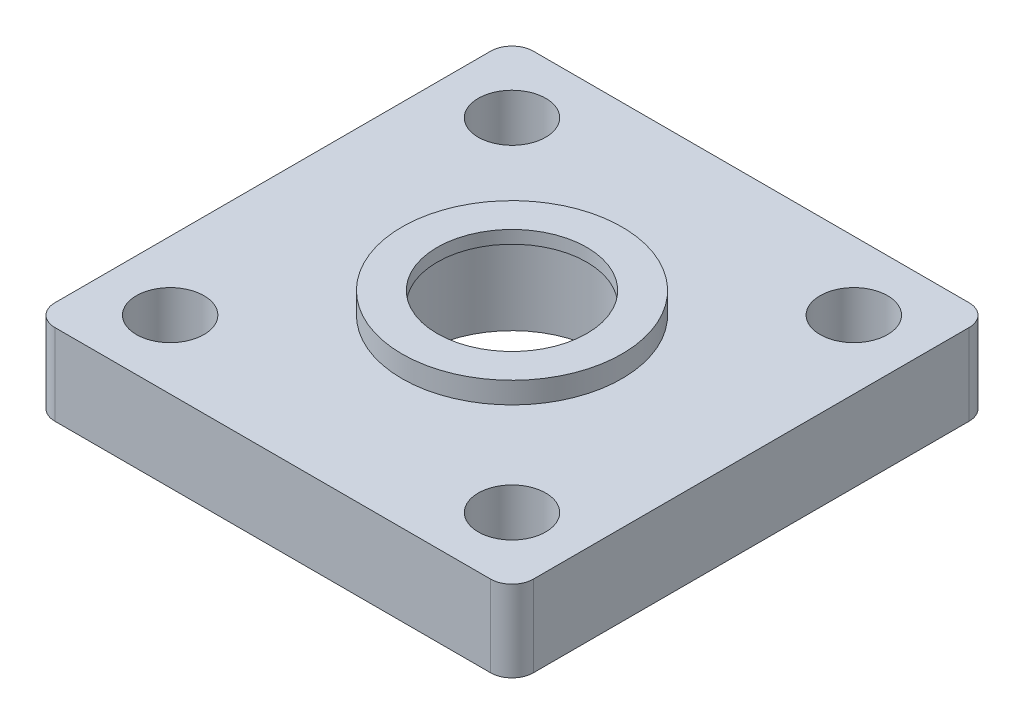
ISO-10303-21;
HEADER;
FILE_DESCRIPTION(('STEP AP214'),'2;1');
FILE_NAME('part.step','',(''),(''),'','','');
FILE_SCHEMA(('AUTOMOTIVE_DESIGN { 1 0 10303 214 1 1 1 1 }'));
ENDSEC;
DATA;
#1=APPLICATION_CONTEXT('core data for automotive mechanical design processes');
#2=APPLICATION_PROTOCOL_DEFINITION('international standard','automotive_design',2000,#1);
#3=PRODUCT_CONTEXT('',#1,'mechanical');
#4=PRODUCT('Part','Part','',(#3));
#5=PRODUCT_RELATED_PRODUCT_CATEGORY('part','',(#4));
#6=PRODUCT_DEFINITION_FORMATION('','',#4);
#7=PRODUCT_DEFINITION_CONTEXT('part definition',#1,'design');
#8=PRODUCT_DEFINITION('design','',#6,#7);
#9=PRODUCT_DEFINITION_SHAPE('','',#8);
#10=(LENGTH_UNIT() NAMED_UNIT(*) SI_UNIT(.MILLI.,.METRE.));
#11=(NAMED_UNIT(*) PLANE_ANGLE_UNIT() SI_UNIT($,.RADIAN.));
#12=(NAMED_UNIT(*) SI_UNIT($,.STERADIAN.) SOLID_ANGLE_UNIT());
#13=UNCERTAINTY_MEASURE_WITH_UNIT(LENGTH_MEASURE(1.E-05),#10,'distance_accuracy_value','');
#14=(GEOMETRIC_REPRESENTATION_CONTEXT(3) GLOBAL_UNCERTAINTY_ASSIGNED_CONTEXT((#13)) GLOBAL_UNIT_ASSIGNED_CONTEXT((#10,
#11,#12)) REPRESENTATION_CONTEXT('',''));
#15=CARTESIAN_POINT('',(0.,0.,0.));
#16=DIRECTION('',(0.,0.,1.));
#17=DIRECTION('',(1.,0.,0.));
#18=AXIS2_PLACEMENT_3D('',#15,#16,#17);
#19=CARTESIAN_POINT('',(0.,0.,0.));
#20=DIRECTION('',(0.,1.,0.));
#21=DIRECTION('',(0.,0.,1.));
#22=AXIS2_PLACEMENT_3D('',#19,#20,#21);
#23=PLANE('',#22);
#24=DIRECTION('',(-1.,0.,0.));
#25=VECTOR('',#24,1.);
#26=CARTESIAN_POINT('',(-56.,0.,-56.));
#27=LINE('',#26,#25);
#28=CARTESIAN_POINT('',(51.,0.,-56.));
#29=VERTEX_POINT('',#28);
#30=CARTESIAN_POINT('',(-51.,0.,-56.));
#31=VERTEX_POINT('',#30);
#32=EDGE_CURVE('E226',#29,#31,#27,.T.);
#33=ORIENTED_EDGE('',*,*,#32,.F.);
#34=CARTESIAN_POINT('',(51.,0.,-51.));
#35=DIRECTION('',(0.,1.,0.));
#36=DIRECTION('',(0.,0.,1.));
#37=AXIS2_PLACEMENT_3D('',#34,#35,#36);
#38=CIRCLE('',#37,5.);
#39=CARTESIAN_POINT('',(56.,0.,-51.));
#40=VERTEX_POINT('',#39);
#41=EDGE_CURVE('E291',#29,#40,#38,.F.);
#42=ORIENTED_EDGE('',*,*,#41,.T.);
#43=DIRECTION('',(0.,0.,-1.));
#44=VECTOR('',#43,1.);
#45=CARTESIAN_POINT('',(56.,0.,-56.));
#46=LINE('',#45,#44);
#47=CARTESIAN_POINT('',(56.,0.,51.));
#48=VERTEX_POINT('',#47);
#49=EDGE_CURVE('E202',#48,#40,#46,.T.);
#50=ORIENTED_EDGE('',*,*,#49,.F.);
#51=CARTESIAN_POINT('',(51.,0.,51.));
#52=DIRECTION('',(0.,1.,0.));
#53=DIRECTION('',(0.,0.,1.));
#54=AXIS2_PLACEMENT_3D('',#51,#52,#53);
#55=CIRCLE('',#54,5.);
#56=CARTESIAN_POINT('',(51.,0.,56.));
#57=VERTEX_POINT('',#56);
#58=EDGE_CURVE('E288',#48,#57,#55,.F.);
#59=ORIENTED_EDGE('',*,*,#58,.T.);
#60=DIRECTION('',(1.,0.,0.));
#61=VECTOR('',#60,1.);
#62=CARTESIAN_POINT('',(-56.,0.,56.));
#63=LINE('',#62,#61);
#64=CARTESIAN_POINT('',(-51.,0.,56.));
#65=VERTEX_POINT('',#64);
#66=EDGE_CURVE('E214',#65,#57,#63,.T.);
#67=ORIENTED_EDGE('',*,*,#66,.F.);
#68=CARTESIAN_POINT('',(-51.,0.,51.));
#69=DIRECTION('',(0.,1.,0.));
#70=DIRECTION('',(0.,0.,1.));
#71=AXIS2_PLACEMENT_3D('',#68,#69,#70);
#72=CIRCLE('',#71,5.);
#73=CARTESIAN_POINT('',(-56.,0.,51.));
#74=VERTEX_POINT('',#73);
#75=EDGE_CURVE('E285',#65,#74,#72,.F.);
#76=ORIENTED_EDGE('',*,*,#75,.T.);
#77=DIRECTION('',(0.,0.,1.));
#78=VECTOR('',#77,1.);
#79=CARTESIAN_POINT('',(-56.,0.,-56.));
#80=LINE('',#79,#78);
#81=CARTESIAN_POINT('',(-56.,0.,-51.));
#82=VERTEX_POINT('',#81);
#83=EDGE_CURVE('E230',#82,#74,#80,.T.);
#84=ORIENTED_EDGE('',*,*,#83,.F.);
#85=CARTESIAN_POINT('',(-51.,0.,-51.));
#86=DIRECTION('',(0.,1.,0.));
#87=DIRECTION('',(0.,0.,1.));
#88=AXIS2_PLACEMENT_3D('',#85,#86,#87);
#89=CIRCLE('',#88,5.);
#90=EDGE_CURVE('E282',#82,#31,#89,.F.);
#91=ORIENTED_EDGE('',*,*,#90,.T.);
#92=EDGE_LOOP('',(#33,#42,#50,#59,#67,#76,#84,#91));
#93=FACE_BOUND('',#92,.T.);
#94=DIRECTION('',(0.,0.,1.));
#95=VECTOR('',#94,1.);
#96=CARTESIAN_POINT('',(50.,0.,50.));
#97=LINE('',#96,#95);
#98=CARTESIAN_POINT('',(50.,0.,-45.));
#99=VERTEX_POINT('',#98);
#100=CARTESIAN_POINT('',(50.,0.,45.));
#101=VERTEX_POINT('',#100);
#102=EDGE_CURVE('E183',#99,#101,#97,.T.);
#103=ORIENTED_EDGE('',*,*,#102,.F.);
#104=CARTESIAN_POINT('',(45.,0.,-45.));
#105=DIRECTION('',(0.,1.,0.));
#106=DIRECTION('',(0.,0.,1.));
#107=AXIS2_PLACEMENT_3D('',#104,#105,#106);
#108=CIRCLE('',#107,5.);
#109=CARTESIAN_POINT('',(45.,0.,-50.));
#110=VERTEX_POINT('',#109);
#111=EDGE_CURVE('E329',#99,#110,#108,.T.);
#112=ORIENTED_EDGE('',*,*,#111,.T.);
#113=DIRECTION('',(1.,0.,0.));
#114=VECTOR('',#113,1.);
#115=CARTESIAN_POINT('',(-50.,0.,-50.));
#116=LINE('',#115,#114);
#117=CARTESIAN_POINT('',(-45.,0.,-50.));
#118=VERTEX_POINT('',#117);
#119=EDGE_CURVE('E188',#118,#110,#116,.T.);
#120=ORIENTED_EDGE('',*,*,#119,.F.);
#121=CARTESIAN_POINT('',(-45.,0.,-45.));
#122=DIRECTION('',(0.,1.,0.));
#123=DIRECTION('',(0.,0.,1.));
#124=AXIS2_PLACEMENT_3D('',#121,#122,#123);
#125=CIRCLE('',#124,5.);
#126=CARTESIAN_POINT('',(-50.,0.,-45.));
#127=VERTEX_POINT('',#126);
#128=EDGE_CURVE('E326',#118,#127,#125,.T.);
#129=ORIENTED_EDGE('',*,*,#128,.T.);
#130=DIRECTION('',(0.,0.,-1.));
#131=VECTOR('',#130,1.);
#132=CARTESIAN_POINT('',(-50.,0.,50.));
#133=LINE('',#132,#131);
#134=CARTESIAN_POINT('',(-50.,0.,45.));
#135=VERTEX_POINT('',#134);
#136=EDGE_CURVE('E182',#135,#127,#133,.T.);
#137=ORIENTED_EDGE('',*,*,#136,.F.);
#138=CARTESIAN_POINT('',(-45.,0.,45.));
#139=DIRECTION('',(0.,1.,0.));
#140=DIRECTION('',(0.,0.,1.));
#141=AXIS2_PLACEMENT_3D('',#138,#139,#140);
#142=CIRCLE('',#141,5.);
#143=CARTESIAN_POINT('',(-45.,0.,50.));
#144=VERTEX_POINT('',#143);
#145=EDGE_CURVE('E165',#135,#144,#142,.T.);
#146=ORIENTED_EDGE('',*,*,#145,.T.);
#147=DIRECTION('',(-1.,0.,0.));
#148=VECTOR('',#147,1.);
#149=CARTESIAN_POINT('',(-50.,0.,50.));
#150=LINE('',#149,#148);
#151=CARTESIAN_POINT('',(45.,0.,50.));
#152=VERTEX_POINT('',#151);
#153=EDGE_CURVE('E172',#152,#144,#150,.T.);
#154=ORIENTED_EDGE('',*,*,#153,.F.);
#155=CARTESIAN_POINT('',(45.,0.,45.));
#156=DIRECTION('',(0.,1.,0.));
#157=DIRECTION('',(0.,0.,1.));
#158=AXIS2_PLACEMENT_3D('',#155,#156,#157);
#159=CIRCLE('',#158,5.);
#160=EDGE_CURVE('E154',#152,#101,#159,.T.);
#161=ORIENTED_EDGE('',*,*,#160,.T.);
#162=EDGE_LOOP('',(#103,#112,#120,#129,#137,#146,#154,#161));
#163=FACE_BOUND('',#162,.T.);
#164=ADVANCED_FACE('F38',(#93,#163),#23,.F.);
#165=CARTESIAN_POINT('',(56.,19.,-56.));
#166=DIRECTION('',(-1.,0.,0.));
#167=DIRECTION('',(0.,0.,1.));
#168=AXIS2_PLACEMENT_3D('',#165,#166,#167);
#169=PLANE('',#168);
#170=ORIENTED_EDGE('',*,*,#49,.T.);
#171=DIRECTION('',(0.,-1.,0.));
#172=VECTOR('',#171,1.);
#173=CARTESIAN_POINT('',(56.,19.,-51.));
#174=LINE('',#173,#172);
#175=CARTESIAN_POINT('',(56.,19.,-51.));
#176=VERTEX_POINT('',#175);
#177=EDGE_CURVE('E298',#40,#176,#174,.F.);
#178=ORIENTED_EDGE('',*,*,#177,.T.);
#179=DIRECTION('',(0.,0.,-1.));
#180=VECTOR('',#179,1.);
#181=CARTESIAN_POINT('',(56.,19.,-56.));
#182=LINE('',#181,#180);
#183=CARTESIAN_POINT('',(56.,19.,51.));
#184=VERTEX_POINT('',#183);
#185=EDGE_CURVE('E209',#184,#176,#182,.T.);
#186=ORIENTED_EDGE('',*,*,#185,.F.);
#187=DIRECTION('',(0.,-1.,0.));
#188=VECTOR('',#187,1.);
#189=CARTESIAN_POINT('',(56.,19.,51.));
#190=LINE('',#189,#188);
#191=EDGE_CURVE('E294',#184,#48,#190,.T.);
#192=ORIENTED_EDGE('',*,*,#191,.T.);
#193=EDGE_LOOP('',(#170,#178,#186,#192));
#194=FACE_BOUND('',#193,.T.);
#195=ADVANCED_FACE('F348',(#194),#169,.F.);
#196=CARTESIAN_POINT('',(-56.,19.,-56.));
#197=DIRECTION('',(0.,0.,1.));
#198=DIRECTION('',(1.,0.,0.));
#199=AXIS2_PLACEMENT_3D('',#196,#197,#198);
#200=PLANE('',#199);
#201=DIRECTION('',(-1.,0.,0.));
#202=VECTOR('',#201,1.);
#203=CARTESIAN_POINT('',(-56.,19.,-56.));
#204=LINE('',#203,#202);
#205=CARTESIAN_POINT('',(51.,19.,-56.));
#206=VERTEX_POINT('',#205);
#207=CARTESIAN_POINT('',(-51.,19.,-56.));
#208=VERTEX_POINT('',#207);
#209=EDGE_CURVE('E213',#206,#208,#204,.T.);
#210=ORIENTED_EDGE('',*,*,#209,.F.);
#211=DIRECTION('',(0.,-1.,0.));
#212=VECTOR('',#211,1.);
#213=CARTESIAN_POINT('',(51.,19.,-56.));
#214=LINE('',#213,#212);
#215=EDGE_CURVE('E278',#206,#29,#214,.T.);
#216=ORIENTED_EDGE('',*,*,#215,.T.);
#217=ORIENTED_EDGE('',*,*,#32,.T.);
#218=DIRECTION('',(0.,-1.,0.));
#219=VECTOR('',#218,1.);
#220=CARTESIAN_POINT('',(-51.,19.,-56.));
#221=LINE('',#220,#219);
#222=EDGE_CURVE('E275',#31,#208,#221,.F.);
#223=ORIENTED_EDGE('',*,*,#222,.T.);
#224=EDGE_LOOP('',(#210,#216,#217,#223));
#225=FACE_BOUND('',#224,.T.);
#226=ADVANCED_FACE('F354',(#225),#200,.F.);
#227=CARTESIAN_POINT('',(-56.,19.,-56.));
#228=DIRECTION('',(1.,0.,0.));
#229=DIRECTION('',(0.,0.,-1.));
#230=AXIS2_PLACEMENT_3D('',#227,#228,#229);
#231=PLANE('',#230);
#232=ORIENTED_EDGE('',*,*,#83,.T.);
#233=DIRECTION('',(0.,-1.,0.));
#234=VECTOR('',#233,1.);
#235=CARTESIAN_POINT('',(-56.,19.,51.));
#236=LINE('',#235,#234);
#237=CARTESIAN_POINT('',(-56.,19.,51.));
#238=VERTEX_POINT('',#237);
#239=EDGE_CURVE('E166',#74,#238,#236,.F.);
#240=ORIENTED_EDGE('',*,*,#239,.T.);
#241=DIRECTION('',(0.,0.,1.));
#242=VECTOR('',#241,1.);
#243=CARTESIAN_POINT('',(-56.,19.,-56.));
#244=LINE('',#243,#242);
#245=CARTESIAN_POINT('',(-56.,19.,-51.));
#246=VERTEX_POINT('',#245);
#247=EDGE_CURVE('E218',#246,#238,#244,.T.);
#248=ORIENTED_EDGE('',*,*,#247,.F.);
#249=DIRECTION('',(0.,-1.,0.));
#250=VECTOR('',#249,1.);
#251=CARTESIAN_POINT('',(-56.,19.,-51.));
#252=LINE('',#251,#250);
#253=EDGE_CURVE('E318',#246,#82,#252,.T.);
#254=ORIENTED_EDGE('',*,*,#253,.T.);
#255=EDGE_LOOP('',(#232,#240,#248,#254));
#256=FACE_BOUND('',#255,.T.);
#257=ADVANCED_FACE('F365',(#256),#231,.F.);
#258=CARTESIAN_POINT('',(-56.,19.,56.));
#259=DIRECTION('',(0.,0.,-1.));
#260=DIRECTION('',(-1.,0.,0.));
#261=AXIS2_PLACEMENT_3D('',#258,#259,#260);
#262=PLANE('',#261);
#263=ORIENTED_EDGE('',*,*,#66,.T.);
#264=DIRECTION('',(0.,-1.,0.));
#265=VECTOR('',#264,1.);
#266=CARTESIAN_POINT('',(51.,19.,56.));
#267=LINE('',#266,#265);
#268=CARTESIAN_POINT('',(51.,19.,56.));
#269=VERTEX_POINT('',#268);
#270=EDGE_CURVE('E54',#57,#269,#267,.F.);
#271=ORIENTED_EDGE('',*,*,#270,.T.);
#272=DIRECTION('',(1.,0.,0.));
#273=VECTOR('',#272,1.);
#274=CARTESIAN_POINT('',(-56.,19.,56.));
#275=LINE('',#274,#273);
#276=CARTESIAN_POINT('',(-51.,19.,56.));
#277=VERTEX_POINT('',#276);
#278=EDGE_CURVE('E208',#277,#269,#275,.T.);
#279=ORIENTED_EDGE('',*,*,#278,.F.);
#280=DIRECTION('',(0.,-1.,0.));
#281=VECTOR('',#280,1.);
#282=CARTESIAN_POINT('',(-51.,19.,56.));
#283=LINE('',#282,#281);
#284=EDGE_CURVE('E312',#277,#65,#283,.T.);
#285=ORIENTED_EDGE('',*,*,#284,.T.);
#286=EDGE_LOOP('',(#263,#271,#279,#285));
#287=FACE_BOUND('',#286,.T.);
#288=ADVANCED_FACE('F362',(#287),#262,.F.);
#289=CARTESIAN_POINT('',(0.,19.,0.));
#290=DIRECTION('',(0.,1.,0.));
#291=DIRECTION('',(0.,0.,1.));
#292=AXIS2_PLACEMENT_3D('',#289,#290,#291);
#293=PLANE('',#292);
#294=CARTESIAN_POINT('',(-40.,19.,40.));
#295=DIRECTION('',(0.,1.,0.));
#296=DIRECTION('',(0.,0.,1.));
#297=AXIS2_PLACEMENT_3D('',#294,#295,#296);
#298=CIRCLE('',#297,7.9);
#299=CARTESIAN_POINT('',(-40.,19.,47.9));
#300=VERTEX_POINT('',#299);
#301=EDGE_CURVE('E426',#300,#300,#298,.T.);
#302=ORIENTED_EDGE('',*,*,#301,.F.);
#303=EDGE_LOOP('',(#302));
#304=FACE_BOUND('',#303,.T.);
#305=CARTESIAN_POINT('',(40.,19.,40.));
#306=DIRECTION('',(0.,1.,0.));
#307=DIRECTION('',(0.,0.,1.));
#308=AXIS2_PLACEMENT_3D('',#305,#306,#307);
#309=CIRCLE('',#308,7.9);
#310=CARTESIAN_POINT('',(40.,19.,47.9));
#311=VERTEX_POINT('',#310);
#312=EDGE_CURVE('E430',#311,#311,#309,.T.);
#313=ORIENTED_EDGE('',*,*,#312,.F.);
#314=EDGE_LOOP('',(#313));
#315=FACE_BOUND('',#314,.T.);
#316=CARTESIAN_POINT('',(40.,19.,-40.));
#317=DIRECTION('',(0.,1.,0.));
#318=DIRECTION('',(0.,0.,1.));
#319=AXIS2_PLACEMENT_3D('',#316,#317,#318);
#320=CIRCLE('',#319,7.9);
#321=CARTESIAN_POINT('',(40.,19.,-32.1));
#322=VERTEX_POINT('',#321);
#323=EDGE_CURVE('E434',#322,#322,#320,.T.);
#324=ORIENTED_EDGE('',*,*,#323,.F.);
#325=EDGE_LOOP('',(#324));
#326=FACE_BOUND('',#325,.T.);
#327=CARTESIAN_POINT('',(-40.,19.,-40.));
#328=DIRECTION('',(0.,1.,0.));
#329=DIRECTION('',(0.,0.,1.));
#330=AXIS2_PLACEMENT_3D('',#327,#328,#329);
#331=CIRCLE('',#330,7.9);
#332=CARTESIAN_POINT('',(-40.,19.,-32.1));
#333=VERTEX_POINT('',#332);
#334=EDGE_CURVE('E438',#333,#333,#331,.T.);
#335=ORIENTED_EDGE('',*,*,#334,.F.);
#336=EDGE_LOOP('',(#335));
#337=FACE_BOUND('',#336,.T.);
#338=CARTESIAN_POINT('',(0.,19.,0.));
#339=DIRECTION('',(0.,1.,0.));
#340=DIRECTION('',(0.,0.,1.));
#341=AXIS2_PLACEMENT_3D('',#338,#339,#340);
#342=CIRCLE('',#341,25.75);
#343=CARTESIAN_POINT('',(0.,19.,25.75));
#344=VERTEX_POINT('',#343);
#345=EDGE_CURVE('E204',#344,#344,#342,.T.);
#346=ORIENTED_EDGE('',*,*,#345,.F.);
#347=EDGE_LOOP('',(#346));
#348=FACE_BOUND('',#347,.T.);
#349=ORIENTED_EDGE('',*,*,#185,.T.);
#350=CARTESIAN_POINT('',(51.,19.,-51.));
#351=DIRECTION('',(0.,1.,0.));
#352=DIRECTION('',(0.,0.,1.));
#353=AXIS2_PLACEMENT_3D('',#350,#351,#352);
#354=CIRCLE('',#353,5.);
#355=EDGE_CURVE('E309',#176,#206,#354,.T.);
#356=ORIENTED_EDGE('',*,*,#355,.T.);
#357=ORIENTED_EDGE('',*,*,#209,.T.);
#358=CARTESIAN_POINT('',(-51.,19.,-51.));
#359=DIRECTION('',(0.,1.,0.));
#360=DIRECTION('',(0.,0.,1.));
#361=AXIS2_PLACEMENT_3D('',#358,#359,#360);
#362=CIRCLE('',#361,5.);
#363=EDGE_CURVE('E301',#208,#246,#362,.T.);
#364=ORIENTED_EDGE('',*,*,#363,.T.);
#365=ORIENTED_EDGE('',*,*,#247,.T.);
#366=CARTESIAN_POINT('',(-51.,19.,51.));
#367=DIRECTION('',(0.,1.,0.));
#368=DIRECTION('',(0.,0.,1.));
#369=AXIS2_PLACEMENT_3D('',#366,#367,#368);
#370=CIRCLE('',#369,5.);
#371=EDGE_CURVE('E61',#238,#277,#370,.T.);
#372=ORIENTED_EDGE('',*,*,#371,.T.);
#373=ORIENTED_EDGE('',*,*,#278,.T.);
#374=CARTESIAN_POINT('',(51.,19.,51.));
#375=DIRECTION('',(0.,1.,0.));
#376=DIRECTION('',(0.,0.,1.));
#377=AXIS2_PLACEMENT_3D('',#374,#375,#376);
#378=CIRCLE('',#377,5.);
#379=EDGE_CURVE('E306',#269,#184,#378,.T.);
#380=ORIENTED_EDGE('',*,*,#379,.T.);
#381=EDGE_LOOP('',(#349,#356,#357,#364,#365,#372,#373,#380));
#382=FACE_BOUND('',#381,.T.);
#383=ADVANCED_FACE('F360',(#304,#315,#326,#337,#348,#382),#293,.T.);
#384=CARTESIAN_POINT('',(0.,24.,0.));
#385=DIRECTION('',(0.,-1.,0.));
#386=DIRECTION('',(0.,0.,-1.));
#387=AXIS2_PLACEMENT_3D('',#384,#385,#386);
#388=CYLINDRICAL_SURFACE('',#387,25.75);
#389=CARTESIAN_POINT('',(0.,24.,0.));
#390=DIRECTION('',(0.,1.,0.));
#391=DIRECTION('',(0.,0.,1.));
#392=AXIS2_PLACEMENT_3D('',#389,#390,#391);
#393=CIRCLE('',#392,25.75);
#394=CARTESIAN_POINT('',(0.,24.,25.75));
#395=VERTEX_POINT('',#394);
#396=EDGE_CURVE('E198',#395,#395,#393,.T.);
#397=ORIENTED_EDGE('',*,*,#396,.F.);
#398=EDGE_LOOP('',(#397));
#399=FACE_BOUND('',#398,.T.);
#400=ORIENTED_EDGE('',*,*,#345,.T.);
#401=EDGE_LOOP('',(#400));
#402=FACE_BOUND('',#401,.T.);
#403=ADVANCED_FACE('F416',(#399,#402),#388,.T.);
#404=CARTESIAN_POINT('',(0.,24.,0.));
#405=DIRECTION('',(0.,1.,0.));
#406=DIRECTION('',(0.,0.,1.));
#407=AXIS2_PLACEMENT_3D('',#404,#405,#406);
#408=PLANE('',#407);
#409=CARTESIAN_POINT('',(0.,24.,0.));
#410=DIRECTION('',(0.,1.,0.));
#411=DIRECTION('',(0.,0.,1.));
#412=AXIS2_PLACEMENT_3D('',#409,#410,#411);
#413=CIRCLE('',#412,17.5);
#414=CARTESIAN_POINT('',(0.,24.,17.5));
#415=VERTEX_POINT('',#414);
#416=EDGE_CURVE('E241',#415,#415,#413,.T.);
#417=ORIENTED_EDGE('',*,*,#416,.F.);
#418=EDGE_LOOP('',(#417));
#419=FACE_BOUND('',#418,.T.);
#420=ORIENTED_EDGE('',*,*,#396,.T.);
#421=EDGE_LOOP('',(#420));
#422=FACE_BOUND('',#421,.T.);
#423=ADVANCED_FACE('F421',(#419,#422),#408,.T.);
#424=CARTESIAN_POINT('',(50.,-5.,50.));
#425=DIRECTION('',(-1.,0.,0.));
#426=DIRECTION('',(0.,0.,1.));
#427=AXIS2_PLACEMENT_3D('',#424,#425,#426);
#428=PLANE('',#427);
#429=ORIENTED_EDGE('',*,*,#102,.T.);
#430=DIRECTION('',(0.,1.,0.));
#431=VECTOR('',#430,1.);
#432=CARTESIAN_POINT('',(50.,-5.,45.));
#433=LINE('',#432,#431);
#434=CARTESIAN_POINT('',(50.,-5.,45.));
#435=VERTEX_POINT('',#434);
#436=EDGE_CURVE('E159',#101,#435,#433,.F.);
#437=ORIENTED_EDGE('',*,*,#436,.T.);
#438=DIRECTION('',(0.,0.,1.));
#439=VECTOR('',#438,1.);
#440=CARTESIAN_POINT('',(50.,-5.,50.));
#441=LINE('',#440,#439);
#442=CARTESIAN_POINT('',(50.,-5.,-45.));
#443=VERTEX_POINT('',#442);
#444=EDGE_CURVE('E197',#443,#435,#441,.T.);
#445=ORIENTED_EDGE('',*,*,#444,.F.);
#446=DIRECTION('',(0.,1.,0.));
#447=VECTOR('',#446,1.);
#448=CARTESIAN_POINT('',(50.,-5.,-45.));
#449=LINE('',#448,#447);
#450=EDGE_CURVE('E177',#443,#99,#449,.T.);
#451=ORIENTED_EDGE('',*,*,#450,.T.);
#452=EDGE_LOOP('',(#429,#437,#445,#451));
#453=FACE_BOUND('',#452,.T.);
#454=ADVANCED_FACE('F496',(#453),#428,.F.);
#455=CARTESIAN_POINT('',(-50.,-5.,50.));
#456=DIRECTION('',(0.,0.,-1.));
#457=DIRECTION('',(-1.,0.,0.));
#458=AXIS2_PLACEMENT_3D('',#455,#456,#457);
#459=PLANE('',#458);
#460=DIRECTION('',(-1.,0.,0.));
#461=VECTOR('',#460,1.);
#462=CARTESIAN_POINT('',(-50.,-5.,50.));
#463=LINE('',#462,#461);
#464=CARTESIAN_POINT('',(45.,-5.,50.));
#465=VERTEX_POINT('',#464);
#466=CARTESIAN_POINT('',(-45.,-5.,50.));
#467=VERTEX_POINT('',#466);
#468=EDGE_CURVE('E175',#465,#467,#463,.T.);
#469=ORIENTED_EDGE('',*,*,#468,.F.);
#470=DIRECTION('',(0.,1.,0.));
#471=VECTOR('',#470,1.);
#472=CARTESIAN_POINT('',(45.,-5.,50.));
#473=LINE('',#472,#471);
#474=EDGE_CURVE('E158',#465,#152,#473,.T.);
#475=ORIENTED_EDGE('',*,*,#474,.T.);
#476=ORIENTED_EDGE('',*,*,#153,.T.);
#477=DIRECTION('',(0.,1.,0.));
#478=VECTOR('',#477,1.);
#479=CARTESIAN_POINT('',(-45.,-5.,50.));
#480=LINE('',#479,#478);
#481=EDGE_CURVE('E178',#144,#467,#480,.F.);
#482=ORIENTED_EDGE('',*,*,#481,.T.);
#483=EDGE_LOOP('',(#469,#475,#476,#482));
#484=FACE_BOUND('',#483,.T.);
#485=ADVANCED_FACE('F171',(#484),#459,.F.);
#486=CARTESIAN_POINT('',(-50.,-5.,50.));
#487=DIRECTION('',(1.,0.,0.));
#488=DIRECTION('',(0.,0.,-1.));
#489=AXIS2_PLACEMENT_3D('',#486,#487,#488);
#490=PLANE('',#489);
#491=DIRECTION('',(0.,0.,-1.));
#492=VECTOR('',#491,1.);
#493=CARTESIAN_POINT('',(-50.,-5.,50.));
#494=LINE('',#493,#492);
#495=CARTESIAN_POINT('',(-50.,-5.,45.));
#496=VERTEX_POINT('',#495);
#497=CARTESIAN_POINT('',(-50.,-5.,-45.));
#498=VERTEX_POINT('',#497);
#499=EDGE_CURVE('E480',#496,#498,#494,.T.);
#500=ORIENTED_EDGE('',*,*,#499,.F.);
#501=DIRECTION('',(0.,1.,0.));
#502=VECTOR('',#501,1.);
#503=CARTESIAN_POINT('',(-50.,-5.,45.));
#504=LINE('',#503,#502);
#505=EDGE_CURVE('E264',#496,#135,#504,.T.);
#506=ORIENTED_EDGE('',*,*,#505,.T.);
#507=ORIENTED_EDGE('',*,*,#136,.T.);
#508=DIRECTION('',(0.,1.,0.));
#509=VECTOR('',#508,1.);
#510=CARTESIAN_POINT('',(-50.,-5.,-45.));
#511=LINE('',#510,#509);
#512=EDGE_CURVE('E261',#127,#498,#511,.F.);
#513=ORIENTED_EDGE('',*,*,#512,.T.);
#514=EDGE_LOOP('',(#500,#506,#507,#513));
#515=FACE_BOUND('',#514,.T.);
#516=ADVANCED_FACE('F502',(#515),#490,.F.);
#517=CARTESIAN_POINT('',(-50.,-5.,-50.));
#518=DIRECTION('',(0.,0.,1.));
#519=DIRECTION('',(1.,0.,0.));
#520=AXIS2_PLACEMENT_3D('',#517,#518,#519);
#521=PLANE('',#520);
#522=DIRECTION('',(1.,0.,0.));
#523=VECTOR('',#522,1.);
#524=CARTESIAN_POINT('',(-50.,-5.,-50.));
#525=LINE('',#524,#523);
#526=CARTESIAN_POINT('',(-45.,-5.,-50.));
#527=VERTEX_POINT('',#526);
#528=CARTESIAN_POINT('',(45.,-5.,-50.));
#529=VERTEX_POINT('',#528);
#530=EDGE_CURVE('E203',#527,#529,#525,.T.);
#531=ORIENTED_EDGE('',*,*,#530,.F.);
#532=DIRECTION('',(0.,1.,0.));
#533=VECTOR('',#532,1.);
#534=CARTESIAN_POINT('',(-45.,-5.,-50.));
#535=LINE('',#534,#533);
#536=EDGE_CURVE('E271',#527,#118,#535,.T.);
#537=ORIENTED_EDGE('',*,*,#536,.T.);
#538=ORIENTED_EDGE('',*,*,#119,.T.);
#539=DIRECTION('',(0.,1.,0.));
#540=VECTOR('',#539,1.);
#541=CARTESIAN_POINT('',(45.,-5.,-50.));
#542=LINE('',#541,#540);
#543=EDGE_CURVE('E268',#110,#529,#542,.F.);
#544=ORIENTED_EDGE('',*,*,#543,.T.);
#545=EDGE_LOOP('',(#531,#537,#538,#544));
#546=FACE_BOUND('',#545,.T.);
#547=ADVANCED_FACE('F498',(#546),#521,.F.);
#548=CARTESIAN_POINT('',(0.,-5.,0.));
#549=DIRECTION('',(0.,-1.,0.));
#550=DIRECTION('',(0.,0.,-1.));
#551=AXIS2_PLACEMENT_3D('',#548,#549,#550);
#552=PLANE('',#551);
#553=CARTESIAN_POINT('',(-40.,-5.,40.));
#554=DIRECTION('',(0.,1.,0.));
#555=DIRECTION('',(0.,0.,1.));
#556=AXIS2_PLACEMENT_3D('',#553,#554,#555);
#557=CIRCLE('',#556,7.9);
#558=CARTESIAN_POINT('',(-40.,-5.,47.9));
#559=VERTEX_POINT('',#558);
#560=EDGE_CURVE('E567',#559,#559,#557,.T.);
#561=ORIENTED_EDGE('',*,*,#560,.T.);
#562=EDGE_LOOP('',(#561));
#563=FACE_BOUND('',#562,.T.);
#564=CARTESIAN_POINT('',(40.,-5.,40.));
#565=DIRECTION('',(0.,1.,0.));
#566=DIRECTION('',(0.,0.,1.));
#567=AXIS2_PLACEMENT_3D('',#564,#565,#566);
#568=CIRCLE('',#567,7.9);
#569=CARTESIAN_POINT('',(40.,-5.,47.9));
#570=VERTEX_POINT('',#569);
#571=EDGE_CURVE('E571',#570,#570,#568,.T.);
#572=ORIENTED_EDGE('',*,*,#571,.T.);
#573=EDGE_LOOP('',(#572));
#574=FACE_BOUND('',#573,.T.);
#575=CARTESIAN_POINT('',(40.,-5.,-40.));
#576=DIRECTION('',(0.,1.,0.));
#577=DIRECTION('',(0.,0.,1.));
#578=AXIS2_PLACEMENT_3D('',#575,#576,#577);
#579=CIRCLE('',#578,7.9);
#580=CARTESIAN_POINT('',(40.,-5.,-32.1));
#581=VERTEX_POINT('',#580);
#582=EDGE_CURVE('E444',#581,#581,#579,.T.);
#583=ORIENTED_EDGE('',*,*,#582,.T.);
#584=EDGE_LOOP('',(#583));
#585=FACE_BOUND('',#584,.T.);
#586=CARTESIAN_POINT('',(-40.,-5.,-40.));
#587=DIRECTION('',(0.,1.,0.));
#588=DIRECTION('',(0.,0.,1.));
#589=AXIS2_PLACEMENT_3D('',#586,#587,#588);
#590=CIRCLE('',#589,7.9);
#591=CARTESIAN_POINT('',(-40.,-5.,-32.1));
#592=VERTEX_POINT('',#591);
#593=EDGE_CURVE('E443',#592,#592,#590,.T.);
#594=ORIENTED_EDGE('',*,*,#593,.T.);
#595=EDGE_LOOP('',(#594));
#596=FACE_BOUND('',#595,.T.);
#597=CARTESIAN_POINT('',(0.,-5.,0.));
#598=DIRECTION('',(0.,-1.,0.));
#599=DIRECTION('',(0.,0.,-1.));
#600=AXIS2_PLACEMENT_3D('',#597,#598,#599);
#601=CIRCLE('',#600,30.);
#602=CARTESIAN_POINT('',(0.,-5.,-30.));
#603=VERTEX_POINT('',#602);
#604=EDGE_CURVE('E465',#603,#603,#601,.T.);
#605=ORIENTED_EDGE('',*,*,#604,.F.);
#606=EDGE_LOOP('',(#605));
#607=FACE_BOUND('',#606,.T.);
#608=ORIENTED_EDGE('',*,*,#444,.T.);
#609=CARTESIAN_POINT('',(45.,-5.,45.));
#610=DIRECTION('',(0.,-1.,0.));
#611=DIRECTION('',(0.,0.,-1.));
#612=AXIS2_PLACEMENT_3D('',#609,#610,#611);
#613=CIRCLE('',#612,5.);
#614=EDGE_CURVE('E258',#435,#465,#613,.T.);
#615=ORIENTED_EDGE('',*,*,#614,.T.);
#616=ORIENTED_EDGE('',*,*,#468,.T.);
#617=CARTESIAN_POINT('',(-45.,-5.,45.));
#618=DIRECTION('',(0.,-1.,0.));
#619=DIRECTION('',(0.,0.,-1.));
#620=AXIS2_PLACEMENT_3D('',#617,#618,#619);
#621=CIRCLE('',#620,5.);
#622=EDGE_CURVE('E255',#467,#496,#621,.T.);
#623=ORIENTED_EDGE('',*,*,#622,.T.);
#624=ORIENTED_EDGE('',*,*,#499,.T.);
#625=CARTESIAN_POINT('',(-45.,-5.,-45.));
#626=DIRECTION('',(0.,-1.,0.));
#627=DIRECTION('',(0.,0.,-1.));
#628=AXIS2_PLACEMENT_3D('',#625,#626,#627);
#629=CIRCLE('',#628,5.);
#630=EDGE_CURVE('E252',#498,#527,#629,.T.);
#631=ORIENTED_EDGE('',*,*,#630,.T.);
#632=ORIENTED_EDGE('',*,*,#530,.T.);
#633=CARTESIAN_POINT('',(45.,-5.,-45.));
#634=DIRECTION('',(0.,-1.,0.));
#635=DIRECTION('',(0.,0.,-1.));
#636=AXIS2_PLACEMENT_3D('',#633,#634,#635);
#637=CIRCLE('',#636,5.);
#638=EDGE_CURVE('E249',#529,#443,#637,.T.);
#639=ORIENTED_EDGE('',*,*,#638,.T.);
#640=EDGE_LOOP('',(#608,#615,#616,#623,#624,#631,#632,#639));
#641=FACE_BOUND('',#640,.T.);
#642=ADVANCED_FACE('F488',(#563,#574,#585,#596,#607,#641),#552,.T.);
#643=CARTESIAN_POINT('',(0.,0.,0.));
#644=DIRECTION('',(0.,-1.,0.));
#645=DIRECTION('',(0.,0.,-1.));
#646=AXIS2_PLACEMENT_3D('',#643,#644,#645);
#647=CYLINDRICAL_SURFACE('',#646,30.);
#648=CARTESIAN_POINT('',(0.,0.,0.));
#649=DIRECTION('',(0.,-1.,0.));
#650=DIRECTION('',(0.,0.,-1.));
#651=AXIS2_PLACEMENT_3D('',#648,#649,#650);
#652=CIRCLE('',#651,30.);
#653=CARTESIAN_POINT('',(0.,0.,-30.));
#654=VERTEX_POINT('',#653);
#655=EDGE_CURVE('E190',#654,#654,#652,.T.);
#656=ORIENTED_EDGE('',*,*,#655,.F.);
#657=EDGE_LOOP('',(#656));
#658=FACE_BOUND('',#657,.T.);
#659=ORIENTED_EDGE('',*,*,#604,.T.);
#660=EDGE_LOOP('',(#659));
#661=FACE_BOUND('',#660,.T.);
#662=ADVANCED_FACE('F556',(#658,#661),#647,.F.);
#663=CARTESIAN_POINT('',(0.,0.,0.));
#664=DIRECTION('',(0.,-1.,0.));
#665=DIRECTION('',(0.,0.,-1.));
#666=AXIS2_PLACEMENT_3D('',#663,#664,#665);
#667=PLANE('',#666);
#668=CARTESIAN_POINT('',(0.,0.,0.));
#669=DIRECTION('',(0.,-1.,0.));
#670=DIRECTION('',(0.,0.,-1.));
#671=AXIS2_PLACEMENT_3D('',#668,#669,#670);
#672=CIRCLE('',#671,26.);
#673=CARTESIAN_POINT('',(0.,0.,-26.));
#674=VERTEX_POINT('',#673);
#675=EDGE_CURVE('E460',#674,#674,#672,.T.);
#676=ORIENTED_EDGE('',*,*,#675,.F.);
#677=EDGE_LOOP('',(#676));
#678=FACE_BOUND('',#677,.T.);
#679=ORIENTED_EDGE('',*,*,#655,.T.);
#680=EDGE_LOOP('',(#679));
#681=FACE_BOUND('',#680,.T.);
#682=ADVANCED_FACE('F552',(#678,#681),#667,.T.);
#683=CARTESIAN_POINT('',(0.,1.,0.));
#684=DIRECTION('',(0.,-1.,0.));
#685=DIRECTION('',(0.,0.,-1.));
#686=AXIS2_PLACEMENT_3D('',#683,#684,#685);
#687=CYLINDRICAL_SURFACE('',#686,26.);
#688=CARTESIAN_POINT('',(0.,1.,0.));
#689=DIRECTION('',(0.,-1.,0.));
#690=DIRECTION('',(0.,0.,-1.));
#691=AXIS2_PLACEMENT_3D('',#688,#689,#690);
#692=CIRCLE('',#691,26.);
#693=CARTESIAN_POINT('',(0.,1.,-26.));
#694=VERTEX_POINT('',#693);
#695=EDGE_CURVE('E461',#694,#694,#692,.T.);
#696=ORIENTED_EDGE('',*,*,#695,.F.);
#697=EDGE_LOOP('',(#696));
#698=FACE_BOUND('',#697,.T.);
#699=ORIENTED_EDGE('',*,*,#675,.T.);
#700=EDGE_LOOP('',(#699));
#701=FACE_BOUND('',#700,.T.);
#702=ADVANCED_FACE('F548',(#698,#701),#687,.F.);
#703=CARTESIAN_POINT('',(0.,1.,0.));
#704=DIRECTION('',(0.,-1.,0.));
#705=DIRECTION('',(0.,0.,-1.));
#706=AXIS2_PLACEMENT_3D('',#703,#704,#705);
#707=PLANE('',#706);
#708=CARTESIAN_POINT('',(0.,1.,0.));
#709=DIRECTION('',(0.,-1.,0.));
#710=DIRECTION('',(0.,0.,-1.));
#711=AXIS2_PLACEMENT_3D('',#708,#709,#710);
#712=CIRCLE('',#711,21.);
#713=CARTESIAN_POINT('',(0.,1.,-21.));
#714=VERTEX_POINT('',#713);
#715=EDGE_CURVE('E240',#714,#714,#712,.T.);
#716=ORIENTED_EDGE('',*,*,#715,.F.);
#717=EDGE_LOOP('',(#716));
#718=FACE_BOUND('',#717,.T.);
#719=ORIENTED_EDGE('',*,*,#695,.T.);
#720=EDGE_LOOP('',(#719));
#721=FACE_BOUND('',#720,.T.);
#722=ADVANCED_FACE('F544',(#718,#721),#707,.T.);
#723=CARTESIAN_POINT('',(0.,21.,0.));
#724=DIRECTION('',(0.,-1.,0.));
#725=DIRECTION('',(0.,0.,-1.));
#726=AXIS2_PLACEMENT_3D('',#723,#724,#725);
#727=CYLINDRICAL_SURFACE('',#726,21.);
#728=CARTESIAN_POINT('',(0.,20.,0.));
#729=DIRECTION('',(0.,-1.,0.));
#730=DIRECTION('',(0.,0.,-1.));
#731=AXIS2_PLACEMENT_3D('',#728,#729,#730);
#732=CIRCLE('',#731,21.);
#733=CARTESIAN_POINT('',(0.,20.,-21.));
#734=VERTEX_POINT('',#733);
#735=EDGE_CURVE('E11',#734,#734,#732,.F.);
#736=ORIENTED_EDGE('',*,*,#735,.T.);
#737=EDGE_LOOP('',(#736));
#738=FACE_BOUND('',#737,.T.);
#739=ORIENTED_EDGE('',*,*,#715,.T.);
#740=EDGE_LOOP('',(#739));
#741=FACE_BOUND('',#740,.T.);
#742=ADVANCED_FACE('F538',(#738,#741),#727,.F.);
#743=CARTESIAN_POINT('',(0.,21.,0.));
#744=DIRECTION('',(0.,-1.,0.));
#745=DIRECTION('',(0.,0.,-1.));
#746=AXIS2_PLACEMENT_3D('',#743,#744,#745);
#747=PLANE('',#746);
#748=CARTESIAN_POINT('',(0.,21.,0.));
#749=DIRECTION('',(0.,-1.,0.));
#750=DIRECTION('',(0.,0.,-1.));
#751=AXIS2_PLACEMENT_3D('',#748,#749,#750);
#752=CIRCLE('',#751,20.);
#753=CARTESIAN_POINT('',(0.,21.,-20.));
#754=VERTEX_POINT('',#753);
#755=EDGE_CURVE('E47',#754,#754,#752,.T.);
#756=ORIENTED_EDGE('',*,*,#755,.T.);
#757=EDGE_LOOP('',(#756));
#758=FACE_BOUND('',#757,.T.);
#759=CARTESIAN_POINT('',(0.,21.,0.));
#760=DIRECTION('',(0.,-1.,0.));
#761=DIRECTION('',(0.,0.,-1.));
#762=AXIS2_PLACEMENT_3D('',#759,#760,#761);
#763=CIRCLE('',#762,17.5);
#764=CARTESIAN_POINT('',(0.,21.,17.5));
#765=VERTEX_POINT('',#764);
#766=EDGE_CURVE('E236',#765,#765,#763,.T.);
#767=ORIENTED_EDGE('',*,*,#766,.F.);
#768=EDGE_LOOP('',(#767));
#769=FACE_BOUND('',#768,.T.);
#770=ADVANCED_FACE('F335',(#758,#769),#747,.T.);
#771=CARTESIAN_POINT('',(0.,-5.,0.));
#772=DIRECTION('',(0.,1.,0.));
#773=DIRECTION('',(0.,0.,1.));
#774=AXIS2_PLACEMENT_3D('',#771,#772,#773);
#775=CYLINDRICAL_SURFACE('',#774,17.5);
#776=CARTESIAN_POINT('',(0.,21.,17.5));
#777=CARTESIAN_POINT('',(0.,21.03125,17.5));
#778=CARTESIAN_POINT('',(0.,21.0625,17.5));
#779=CARTESIAN_POINT('',(0.,21.125,17.5));
#780=CARTESIAN_POINT('',(0.,21.15625,17.5));
#781=CARTESIAN_POINT('',(0.,21.21875,17.5));
#782=CARTESIAN_POINT('',(0.,21.25,17.5));
#783=CARTESIAN_POINT('',(0.,21.3125,17.5));
#784=CARTESIAN_POINT('',(0.,21.34375,17.5));
#785=CARTESIAN_POINT('',(0.,21.40625,17.5));
#786=CARTESIAN_POINT('',(0.,21.4375,17.5));
#787=CARTESIAN_POINT('',(0.,21.5,17.5));
#788=CARTESIAN_POINT('',(0.,21.53125,17.5));
#789=CARTESIAN_POINT('',(0.,21.59375,17.5));
#790=CARTESIAN_POINT('',(0.,21.625,17.5));
#791=CARTESIAN_POINT('',(0.,21.6875,17.5));
#792=CARTESIAN_POINT('',(0.,21.71875,17.5));
#793=CARTESIAN_POINT('',(0.,21.78125,17.5));
#794=CARTESIAN_POINT('',(0.,21.8125,17.5));
#795=CARTESIAN_POINT('',(0.,21.875,17.5));
#796=CARTESIAN_POINT('',(0.,21.90625,17.5));
#797=CARTESIAN_POINT('',(0.,21.96875,17.5));
#798=CARTESIAN_POINT('',(0.,22.,17.5));
#799=CARTESIAN_POINT('',(0.,22.0625,17.5));
#800=CARTESIAN_POINT('',(0.,22.09375,17.5));
#801=CARTESIAN_POINT('',(0.,22.15625,17.5));
#802=CARTESIAN_POINT('',(0.,22.1875,17.5));
#803=CARTESIAN_POINT('',(0.,22.25,17.5));
#804=CARTESIAN_POINT('',(0.,22.28125,17.5));
#805=CARTESIAN_POINT('',(0.,22.34375,17.5));
#806=CARTESIAN_POINT('',(0.,22.375,17.5));
#807=CARTESIAN_POINT('',(0.,22.4375,17.5));
#808=CARTESIAN_POINT('',(0.,22.46875,17.5));
#809=CARTESIAN_POINT('',(0.,22.53125,17.5));
#810=CARTESIAN_POINT('',(0.,22.5625,17.5));
#811=CARTESIAN_POINT('',(0.,22.625,17.5));
#812=CARTESIAN_POINT('',(0.,22.65625,17.5));
#813=CARTESIAN_POINT('',(0.,22.71875,17.5));
#814=CARTESIAN_POINT('',(0.,22.75,17.5));
#815=CARTESIAN_POINT('',(0.,22.8125,17.5));
#816=CARTESIAN_POINT('',(0.,22.84375,17.5));
#817=CARTESIAN_POINT('',(0.,22.90625,17.5));
#818=CARTESIAN_POINT('',(0.,22.9375,17.5));
#819=CARTESIAN_POINT('',(0.,23.,17.5));
#820=CARTESIAN_POINT('',(0.,23.03125,17.5));
#821=CARTESIAN_POINT('',(0.,23.09375,17.5));
#822=CARTESIAN_POINT('',(0.,23.125,17.5));
#823=CARTESIAN_POINT('',(0.,23.1875,17.5));
#824=CARTESIAN_POINT('',(0.,23.21875,17.5));
#825=CARTESIAN_POINT('',(0.,23.28125,17.5));
#826=CARTESIAN_POINT('',(0.,23.3125,17.5));
#827=CARTESIAN_POINT('',(0.,23.375,17.5));
#828=CARTESIAN_POINT('',(0.,23.40625,17.5));
#829=CARTESIAN_POINT('',(0.,23.46875,17.5));
#830=CARTESIAN_POINT('',(0.,23.5,17.5));
#831=CARTESIAN_POINT('',(0.,23.5625,17.5));
#832=CARTESIAN_POINT('',(0.,23.59375,17.5));
#833=CARTESIAN_POINT('',(0.,23.65625,17.5));
#834=CARTESIAN_POINT('',(0.,23.6875,17.5));
#835=CARTESIAN_POINT('',(0.,23.75,17.5));
#836=CARTESIAN_POINT('',(0.,23.78125,17.5));
#837=CARTESIAN_POINT('',(0.,23.84375,17.5));
#838=CARTESIAN_POINT('',(0.,23.875,17.5));
#839=CARTESIAN_POINT('',(0.,23.9375,17.5));
#840=CARTESIAN_POINT('',(0.,23.96875,17.5));
#841=CARTESIAN_POINT('',(0.,24.,17.5));
#842=B_SPLINE_CURVE_WITH_KNOTS('',3,(#776,#777,#778,#779,#780,#781,#782,#783,#784,#785,#786,
#787,#788,#789,#790,#791,#792,#793,#794,#795,#796,#797,#798,#799,#800,#801,#802,#803,#804,#805,
#806,#807,#808,#809,#810,#811,#812,#813,#814,#815,#816,#817,#818,#819,#820,#821,#822,#823,#824,
#825,#826,#827,#828,#829,#830,#831,#832,#833,#834,#835,#836,#837,#838,#839,#840,#841),
.UNSPECIFIED.,.F.,.F.,(4,2,2,2,2,2,2,2,2,2,2,2,2,2,2,2,2,2,2,2,2,2,2,2,2,2,2,2,2,2,2,2,4),(0.,
0.0937500000000001,0.1875,0.28125,0.375,0.46875,0.5625,0.656250000000001,0.750000000000001,
0.843749999999997,0.937499999999997,1.03125,1.125,1.21875,1.3125,1.40625,1.5,1.59375,1.6875,
1.78125,1.875,1.96875,2.0625,2.15625,2.25,2.34375,2.4375,2.53125,2.625,2.71875,2.8125,2.90625,
3.),.UNSPECIFIED.);
#843=EDGE_CURVE('BSEAM525',#765,#415,#842,.T.);
#844=ORIENTED_EDGE('',*,*,#766,.T.);
#845=ORIENTED_EDGE('',*,*,#416,.T.);
#846=ORIENTED_EDGE('',*,*,#843,.T.);
#847=ORIENTED_EDGE('',*,*,#843,.F.);
#848=EDGE_LOOP('',(#844,#846,#845,#847));
#849=FACE_BOUND('',#848,.T.);
#850=ADVANCED_FACE('F525',(#849),#775,.F.);
#851=CARTESIAN_POINT('',(-40.,-5.,-40.));
#852=DIRECTION('',(0.,1.,0.));
#853=DIRECTION('',(0.,0.,1.));
#854=AXIS2_PLACEMENT_3D('',#851,#852,#853);
#855=CYLINDRICAL_SURFACE('',#854,7.9);
#856=ORIENTED_EDGE('',*,*,#593,.F.);
#857=EDGE_LOOP('',(#856));
#858=FACE_BOUND('',#857,.T.);
#859=ORIENTED_EDGE('',*,*,#334,.T.);
#860=EDGE_LOOP('',(#859));
#861=FACE_BOUND('',#860,.T.);
#862=ADVANCED_FACE('F527',(#858,#861),#855,.F.);
#863=CARTESIAN_POINT('',(40.,-5.,-40.));
#864=DIRECTION('',(0.,1.,0.));
#865=DIRECTION('',(0.,0.,1.));
#866=AXIS2_PLACEMENT_3D('',#863,#864,#865);
#867=CYLINDRICAL_SURFACE('',#866,7.9);
#868=ORIENTED_EDGE('',*,*,#582,.F.);
#869=EDGE_LOOP('',(#868));
#870=FACE_BOUND('',#869,.T.);
#871=ORIENTED_EDGE('',*,*,#323,.T.);
#872=EDGE_LOOP('',(#871));
#873=FACE_BOUND('',#872,.T.);
#874=ADVANCED_FACE('F534',(#870,#873),#867,.F.);
#875=CARTESIAN_POINT('',(40.,-5.,40.));
#876=DIRECTION('',(0.,1.,0.));
#877=DIRECTION('',(0.,0.,1.));
#878=AXIS2_PLACEMENT_3D('',#875,#876,#877);
#879=CYLINDRICAL_SURFACE('',#878,7.9);
#880=ORIENTED_EDGE('',*,*,#571,.F.);
#881=EDGE_LOOP('',(#880));
#882=FACE_BOUND('',#881,.T.);
#883=ORIENTED_EDGE('',*,*,#312,.T.);
#884=EDGE_LOOP('',(#883));
#885=FACE_BOUND('',#884,.T.);
#886=ADVANCED_FACE('F581',(#882,#885),#879,.F.);
#887=CARTESIAN_POINT('',(-40.,-5.,40.));
#888=DIRECTION('',(0.,1.,0.));
#889=DIRECTION('',(0.,0.,1.));
#890=AXIS2_PLACEMENT_3D('',#887,#888,#889);
#891=CYLINDRICAL_SURFACE('',#890,7.9);
#892=ORIENTED_EDGE('',*,*,#560,.F.);
#893=EDGE_LOOP('',(#892));
#894=FACE_BOUND('',#893,.T.);
#895=ORIENTED_EDGE('',*,*,#301,.T.);
#896=EDGE_LOOP('',(#895));
#897=FACE_BOUND('',#896,.T.);
#898=ADVANCED_FACE('F375',(#894,#897),#891,.F.);
#899=CARTESIAN_POINT('',(45.,-5.,45.));
#900=DIRECTION('',(0.,1.,0.));
#901=DIRECTION('',(0.,0.,1.));
#902=AXIS2_PLACEMENT_3D('',#899,#900,#901);
#903=CYLINDRICAL_SURFACE('',#902,5.);
#904=ORIENTED_EDGE('',*,*,#614,.F.);
#905=ORIENTED_EDGE('',*,*,#436,.F.);
#906=ORIENTED_EDGE('',*,*,#160,.F.);
#907=ORIENTED_EDGE('',*,*,#474,.F.);
#908=EDGE_LOOP('',(#904,#905,#906,#907));
#909=FACE_BOUND('',#908,.T.);
#910=ADVANCED_FACE('F157',(#909),#903,.T.);
#911=CARTESIAN_POINT('',(-45.,-5.,45.));
#912=DIRECTION('',(0.,1.,0.));
#913=DIRECTION('',(0.,0.,1.));
#914=AXIS2_PLACEMENT_3D('',#911,#912,#913);
#915=CYLINDRICAL_SURFACE('',#914,5.);
#916=ORIENTED_EDGE('',*,*,#622,.F.);
#917=ORIENTED_EDGE('',*,*,#481,.F.);
#918=ORIENTED_EDGE('',*,*,#145,.F.);
#919=ORIENTED_EDGE('',*,*,#505,.F.);
#920=EDGE_LOOP('',(#916,#917,#918,#919));
#921=FACE_BOUND('',#920,.T.);
#922=ADVANCED_FACE('F374',(#921),#915,.T.);
#923=CARTESIAN_POINT('',(-45.,-5.,-45.));
#924=DIRECTION('',(0.,1.,0.));
#925=DIRECTION('',(0.,0.,1.));
#926=AXIS2_PLACEMENT_3D('',#923,#924,#925);
#927=CYLINDRICAL_SURFACE('',#926,5.);
#928=ORIENTED_EDGE('',*,*,#630,.F.);
#929=ORIENTED_EDGE('',*,*,#512,.F.);
#930=ORIENTED_EDGE('',*,*,#128,.F.);
#931=ORIENTED_EDGE('',*,*,#536,.F.);
#932=EDGE_LOOP('',(#928,#929,#930,#931));
#933=FACE_BOUND('',#932,.T.);
#934=ADVANCED_FACE('F378',(#933),#927,.T.);
#935=CARTESIAN_POINT('',(45.,-5.,-45.));
#936=DIRECTION('',(0.,1.,0.));
#937=DIRECTION('',(0.,0.,1.));
#938=AXIS2_PLACEMENT_3D('',#935,#936,#937);
#939=CYLINDRICAL_SURFACE('',#938,5.);
#940=ORIENTED_EDGE('',*,*,#638,.F.);
#941=ORIENTED_EDGE('',*,*,#543,.F.);
#942=ORIENTED_EDGE('',*,*,#111,.F.);
#943=ORIENTED_EDGE('',*,*,#450,.F.);
#944=EDGE_LOOP('',(#940,#941,#942,#943));
#945=FACE_BOUND('',#944,.T.);
#946=ADVANCED_FACE('F382',(#945),#939,.T.);
#947=CARTESIAN_POINT('',(51.,19.,-51.));
#948=DIRECTION('',(0.,-1.,0.));
#949=DIRECTION('',(0.,0.,-1.));
#950=AXIS2_PLACEMENT_3D('',#947,#948,#949);
#951=CYLINDRICAL_SURFACE('',#950,5.);
#952=ORIENTED_EDGE('',*,*,#355,.F.);
#953=ORIENTED_EDGE('',*,*,#177,.F.);
#954=ORIENTED_EDGE('',*,*,#41,.F.);
#955=ORIENTED_EDGE('',*,*,#215,.F.);
#956=EDGE_LOOP('',(#952,#953,#954,#955));
#957=FACE_BOUND('',#956,.T.);
#958=ADVANCED_FACE('F386',(#957),#951,.T.);
#959=CARTESIAN_POINT('',(51.,19.,51.));
#960=DIRECTION('',(0.,-1.,0.));
#961=DIRECTION('',(0.,0.,-1.));
#962=AXIS2_PLACEMENT_3D('',#959,#960,#961);
#963=CYLINDRICAL_SURFACE('',#962,5.);
#964=ORIENTED_EDGE('',*,*,#379,.F.);
#965=ORIENTED_EDGE('',*,*,#270,.F.);
#966=ORIENTED_EDGE('',*,*,#58,.F.);
#967=ORIENTED_EDGE('',*,*,#191,.F.);
#968=EDGE_LOOP('',(#964,#965,#966,#967));
#969=FACE_BOUND('',#968,.T.);
#970=ADVANCED_FACE('F390',(#969),#963,.T.);
#971=CARTESIAN_POINT('',(-51.,19.,51.));
#972=DIRECTION('',(0.,-1.,0.));
#973=DIRECTION('',(0.,0.,-1.));
#974=AXIS2_PLACEMENT_3D('',#971,#972,#973);
#975=CYLINDRICAL_SURFACE('',#974,5.);
#976=ORIENTED_EDGE('',*,*,#371,.F.);
#977=ORIENTED_EDGE('',*,*,#239,.F.);
#978=ORIENTED_EDGE('',*,*,#75,.F.);
#979=ORIENTED_EDGE('',*,*,#284,.F.);
#980=EDGE_LOOP('',(#976,#977,#978,#979));
#981=FACE_BOUND('',#980,.T.);
#982=ADVANCED_FACE('F344',(#981),#975,.T.);
#983=CARTESIAN_POINT('',(-51.,19.,-51.));
#984=DIRECTION('',(0.,-1.,0.));
#985=DIRECTION('',(0.,0.,-1.));
#986=AXIS2_PLACEMENT_3D('',#983,#984,#985);
#987=CYLINDRICAL_SURFACE('',#986,5.);
#988=ORIENTED_EDGE('',*,*,#363,.F.);
#989=ORIENTED_EDGE('',*,*,#222,.F.);
#990=ORIENTED_EDGE('',*,*,#90,.F.);
#991=ORIENTED_EDGE('',*,*,#253,.F.);
#992=EDGE_LOOP('',(#988,#989,#990,#991));
#993=FACE_BOUND('',#992,.T.);
#994=ADVANCED_FACE('F339',(#993),#987,.T.);
#995=CARTESIAN_POINT('',(0.,20.,0.));
#996=DIRECTION('',(0.,-1.,0.));
#997=DIRECTION('',(0.,0.,-1.));
#998=AXIS2_PLACEMENT_3D('',#995,#996,#997);
#999=TOROIDAL_SURFACE('',#998,20.,1.);
#1000=ORIENTED_EDGE('',*,*,#735,.F.);
#1001=EDGE_LOOP('',(#1000));
#1002=FACE_BOUND('',#1001,.T.);
#1003=ORIENTED_EDGE('',*,*,#755,.F.);
#1004=EDGE_LOOP('',(#1003));
#1005=FACE_BOUND('',#1004,.T.);
#1006=ADVANCED_FACE('F40',(#1002,#1005),#999,.F.);
#1007=CLOSED_SHELL('',(#164,#195,#226,#257,#288,#383,#403,#423,#454,#485,#516,#547,#642,#662,
#682,#702,#722,#742,#770,#850,#862,#874,#886,#898,#910,#922,#934,#946,#958,#970,#982,#994,#1006));
#1008=MANIFOLD_SOLID_BREP('B2',#1007);
#1009=ADVANCED_BREP_SHAPE_REPRESENTATION('',(#18,#1008),#14);
#1010=SHAPE_DEFINITION_REPRESENTATION(#9,#1009);
ENDSEC;
END-ISO-10303-21;
